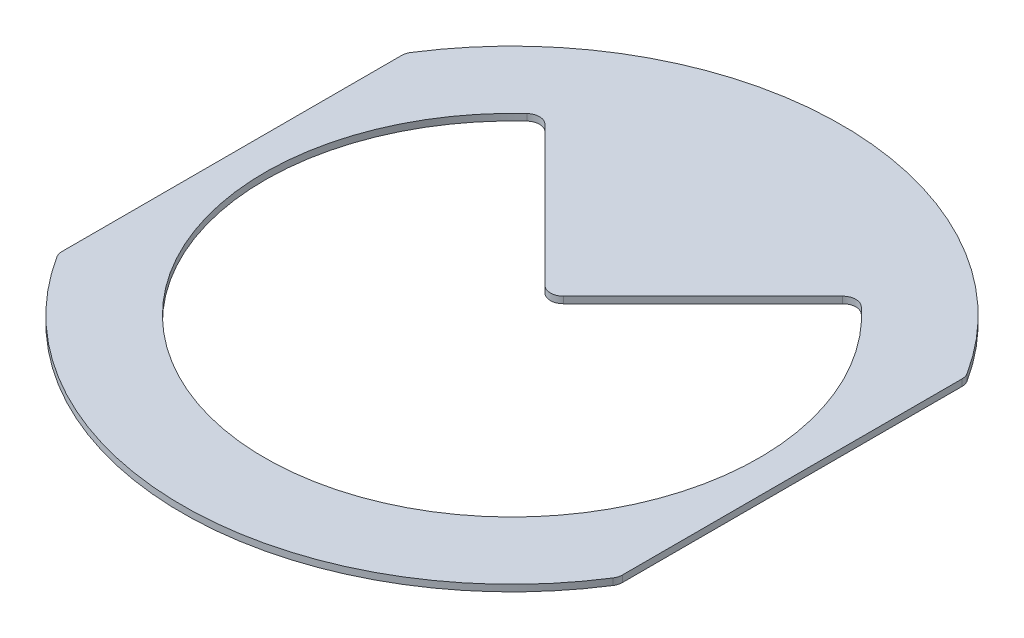
ISO-10303-21;
HEADER;
FILE_DESCRIPTION(('STEP AP214'),'2;1');
FILE_NAME('part.step','',(''),(''),'','','');
FILE_SCHEMA(('AUTOMOTIVE_DESIGN { 1 0 10303 214 1 1 1 1 }'));
ENDSEC;
DATA;
#1=APPLICATION_CONTEXT('core data for automotive mechanical design processes');
#2=APPLICATION_PROTOCOL_DEFINITION('international standard','automotive_design',2000,#1);
#3=PRODUCT_CONTEXT('',#1,'mechanical');
#4=PRODUCT('Part','Part','',(#3));
#5=PRODUCT_RELATED_PRODUCT_CATEGORY('part','',(#4));
#6=PRODUCT_DEFINITION_FORMATION('','',#4);
#7=PRODUCT_DEFINITION_CONTEXT('part definition',#1,'design');
#8=PRODUCT_DEFINITION('design','',#6,#7);
#9=PRODUCT_DEFINITION_SHAPE('','',#8);
#10=(LENGTH_UNIT() NAMED_UNIT(*) SI_UNIT(.MILLI.,.METRE.));
#11=(NAMED_UNIT(*) PLANE_ANGLE_UNIT() SI_UNIT($,.RADIAN.));
#12=(NAMED_UNIT(*) SI_UNIT($,.STERADIAN.) SOLID_ANGLE_UNIT());
#13=UNCERTAINTY_MEASURE_WITH_UNIT(LENGTH_MEASURE(1.E-05),#10,'distance_accuracy_value','');
#14=(GEOMETRIC_REPRESENTATION_CONTEXT(3) GLOBAL_UNCERTAINTY_ASSIGNED_CONTEXT((#13)) GLOBAL_UNIT_ASSIGNED_CONTEXT((#10,
#11,#12)) REPRESENTATION_CONTEXT('',''));
#15=CARTESIAN_POINT('',(0.,0.,0.));
#16=DIRECTION('',(0.,0.,1.));
#17=DIRECTION('',(1.,0.,0.));
#18=AXIS2_PLACEMENT_3D('',#15,#16,#17);
#19=CARTESIAN_POINT('',(0.,1.,0.));
#20=DIRECTION('',(0.,1.,0.));
#21=DIRECTION('',(0.,0.,1.));
#22=AXIS2_PLACEMENT_3D('',#19,#20,#21);
#23=PLANE('',#22);
#24=DIRECTION('',(0.,0.,-1.));
#25=VECTOR('',#24,1.);
#26=CARTESIAN_POINT('',(42.5,1.,-26.3391343821319));
#27=LINE('',#26,#25);
#28=CARTESIAN_POINT('',(42.5,1.,25.7633460559765));
#29=VERTEX_POINT('',#28);
#30=CARTESIAN_POINT('',(42.5,1.,-25.7633460559765));
#31=VERTEX_POINT('',#30);
#32=EDGE_CURVE('E162',#29,#31,#27,.T.);
#33=ORIENTED_EDGE('',*,*,#32,.T.);
#34=CARTESIAN_POINT('',(40.5,1.,-25.7633460559765));
#35=DIRECTION('',(0.,1.,0.));
#36=DIRECTION('',(0.,0.,1.));
#37=AXIS2_PLACEMENT_3D('',#34,#35,#36);
#38=CIRCLE('',#37,2.);
#39=CARTESIAN_POINT('',(42.1875,1.,-26.8368188083089));
#40=VERTEX_POINT('',#39);
#41=EDGE_CURVE('E203',#31,#40,#38,.T.);
#42=ORIENTED_EDGE('',*,*,#41,.T.);
#43=CARTESIAN_POINT('',(0.,1.,0.));
#44=DIRECTION('',(0.,1.,0.));
#45=DIRECTION('',(0.,0.,1.));
#46=AXIS2_PLACEMENT_3D('',#43,#44,#45);
#47=CIRCLE('',#46,50.);
#48=CARTESIAN_POINT('',(-42.1875,1.,-26.8368188083089));
#49=VERTEX_POINT('',#48);
#50=EDGE_CURVE('E245',#40,#49,#47,.T.);
#51=ORIENTED_EDGE('',*,*,#50,.T.);
#52=CARTESIAN_POINT('',(-40.5,1.,-25.7633460559765));
#53=DIRECTION('',(0.,1.,0.));
#54=DIRECTION('',(0.,0.,1.));
#55=AXIS2_PLACEMENT_3D('',#52,#53,#54);
#56=CIRCLE('',#55,2.);
#57=CARTESIAN_POINT('',(-42.5,1.,-25.7633460559765));
#58=VERTEX_POINT('',#57);
#59=EDGE_CURVE('E198',#49,#58,#56,.T.);
#60=ORIENTED_EDGE('',*,*,#59,.T.);
#61=DIRECTION('',(0.,0.,1.));
#62=VECTOR('',#61,1.);
#63=CARTESIAN_POINT('',(-42.5,1.,-26.3391343821319));
#64=LINE('',#63,#62);
#65=CARTESIAN_POINT('',(-42.5,1.,25.7633460559765));
#66=VERTEX_POINT('',#65);
#67=EDGE_CURVE('E248',#58,#66,#64,.T.);
#68=ORIENTED_EDGE('',*,*,#67,.T.);
#69=CARTESIAN_POINT('',(-40.5,1.,25.7633460559765));
#70=DIRECTION('',(0.,1.,0.));
#71=DIRECTION('',(0.,0.,1.));
#72=AXIS2_PLACEMENT_3D('',#69,#70,#71);
#73=CIRCLE('',#72,2.);
#74=CARTESIAN_POINT('',(-42.1875,1.,26.8368188083089));
#75=VERTEX_POINT('',#74);
#76=EDGE_CURVE('E57',#66,#75,#73,.T.);
#77=ORIENTED_EDGE('',*,*,#76,.T.);
#78=CARTESIAN_POINT('',(0.,1.,0.));
#79=DIRECTION('',(0.,1.,0.));
#80=DIRECTION('',(0.,0.,1.));
#81=AXIS2_PLACEMENT_3D('',#78,#79,#80);
#82=CIRCLE('',#81,50.);
#83=CARTESIAN_POINT('',(42.1875,1.,26.8368188083088));
#84=VERTEX_POINT('',#83);
#85=EDGE_CURVE('E167',#75,#84,#82,.T.);
#86=ORIENTED_EDGE('',*,*,#85,.T.);
#87=CARTESIAN_POINT('',(40.5,1.,25.7633460559765));
#88=DIRECTION('',(0.,1.,0.));
#89=DIRECTION('',(0.,0.,1.));
#90=AXIS2_PLACEMENT_3D('',#87,#88,#89);
#91=CIRCLE('',#90,2.);
#92=EDGE_CURVE('E201',#84,#29,#91,.T.);
#93=ORIENTED_EDGE('',*,*,#92,.T.);
#94=EDGE_LOOP('',(#33,#42,#51,#60,#68,#77,#86,#93));
#95=FACE_BOUND('',#94,.T.);
#96=DIRECTION('',(-0.707106781186547,0.,-0.707106781186549));
#97=VECTOR('',#96,1.);
#98=CARTESIAN_POINT('',(-23.8983901024285,1.,-28.8983901024286));
#99=LINE('',#98,#97);
#100=CARTESIAN_POINT('',(-1.41421356237309,1.,-6.4142135623731));
#101=VERTEX_POINT('',#100);
#102=CARTESIAN_POINT('',(-22.5787971763373,1.,-27.5787971763374));
#103=VERTEX_POINT('',#102);
#104=EDGE_CURVE('E239',#101,#103,#99,.T.);
#105=ORIENTED_EDGE('',*,*,#104,.F.);
#106=CARTESIAN_POINT('',(0.,1.,-7.8284271247462));
#107=DIRECTION('',(0.,1.,0.));
#108=DIRECTION('',(0.,0.,1.));
#109=AXIS2_PLACEMENT_3D('',#106,#107,#108);
#110=CIRCLE('',#109,2.);
#111=CARTESIAN_POINT('',(1.41421356237311,1.,-6.4142135623731));
#112=VERTEX_POINT('',#111);
#113=EDGE_CURVE('E161',#101,#112,#110,.T.);
#114=ORIENTED_EDGE('',*,*,#113,.T.);
#115=DIRECTION('',(-0.707106781186546,0.,0.707106781186549));
#116=VECTOR('',#115,1.);
#117=CARTESIAN_POINT('',(0.,1.,-5.));
#118=LINE('',#117,#116);
#119=CARTESIAN_POINT('',(22.5787971763373,1.,-27.5787971763374));
#120=VERTEX_POINT('',#119);
#121=EDGE_CURVE('E234',#120,#112,#118,.T.);
#122=ORIENTED_EDGE('',*,*,#121,.F.);
#123=CARTESIAN_POINT('',(23.9930107387104,1.,-26.1645836139643));
#124=DIRECTION('',(0.,1.,0.));
#125=DIRECTION('',(0.,0.,1.));
#126=AXIS2_PLACEMENT_3D('',#123,#124,#125);
#127=CIRCLE('',#126,2.);
#128=CARTESIAN_POINT('',(25.3447296535673,1.,-27.6386446626383));
#129=VERTEX_POINT('',#128);
#130=EDGE_CURVE('E11',#120,#129,#127,.F.);
#131=ORIENTED_EDGE('',*,*,#130,.T.);
#132=CARTESIAN_POINT('',(0.,1.,0.));
#133=DIRECTION('',(0.,1.,0.));
#134=DIRECTION('',(0.,0.,1.));
#135=AXIS2_PLACEMENT_3D('',#132,#133,#134);
#136=CIRCLE('',#135,37.5);
#137=CARTESIAN_POINT('',(-25.3447296535673,1.,-27.6386446626383));
#138=VERTEX_POINT('',#137);
#139=EDGE_CURVE('E158',#138,#129,#136,.T.);
#140=ORIENTED_EDGE('',*,*,#139,.F.);
#141=CARTESIAN_POINT('',(-23.9930107387104,1.,-26.1645836139643));
#142=DIRECTION('',(0.,1.,0.));
#143=DIRECTION('',(0.,0.,1.));
#144=AXIS2_PLACEMENT_3D('',#141,#142,#143);
#145=CIRCLE('',#144,2.);
#146=EDGE_CURVE('E216',#138,#103,#145,.F.);
#147=ORIENTED_EDGE('',*,*,#146,.T.);
#148=EDGE_LOOP('',(#105,#114,#122,#131,#140,#147));
#149=FACE_BOUND('',#148,.T.);
#150=ADVANCED_FACE('F35',(#95,#149),#23,.T.);
#151=CARTESIAN_POINT('',(0.,0.,0.));
#152=DIRECTION('',(0.,1.,0.));
#153=DIRECTION('',(0.,0.,1.));
#154=AXIS2_PLACEMENT_3D('',#151,#152,#153);
#155=PLANE('',#154);
#156=CARTESIAN_POINT('',(0.,0.,0.));
#157=DIRECTION('',(0.,1.,0.));
#158=DIRECTION('',(0.,0.,1.));
#159=AXIS2_PLACEMENT_3D('',#156,#157,#158);
#160=CIRCLE('',#159,50.);
#161=CARTESIAN_POINT('',(42.1875,0.,-26.8368188083089));
#162=VERTEX_POINT('',#161);
#163=CARTESIAN_POINT('',(-42.1875,0.,-26.8368188083089));
#164=VERTEX_POINT('',#163);
#165=EDGE_CURVE('E243',#162,#164,#160,.T.);
#166=ORIENTED_EDGE('',*,*,#165,.F.);
#167=CARTESIAN_POINT('',(40.5,0.,-25.7633460559765));
#168=DIRECTION('',(0.,1.,0.));
#169=DIRECTION('',(0.,0.,1.));
#170=AXIS2_PLACEMENT_3D('',#167,#168,#169);
#171=CIRCLE('',#170,2.);
#172=CARTESIAN_POINT('',(42.5,0.,-25.7633460559765));
#173=VERTEX_POINT('',#172);
#174=EDGE_CURVE('E190',#162,#173,#171,.F.);
#175=ORIENTED_EDGE('',*,*,#174,.T.);
#176=DIRECTION('',(0.,0.,-1.));
#177=VECTOR('',#176,1.);
#178=CARTESIAN_POINT('',(42.5,0.,-26.3391343821319));
#179=LINE('',#178,#177);
#180=CARTESIAN_POINT('',(42.5,0.,25.7633460559765));
#181=VERTEX_POINT('',#180);
#182=EDGE_CURVE('E170',#181,#173,#179,.T.);
#183=ORIENTED_EDGE('',*,*,#182,.F.);
#184=CARTESIAN_POINT('',(40.5,0.,25.7633460559765));
#185=DIRECTION('',(0.,1.,0.));
#186=DIRECTION('',(0.,0.,1.));
#187=AXIS2_PLACEMENT_3D('',#184,#185,#186);
#188=CIRCLE('',#187,2.);
#189=CARTESIAN_POINT('',(42.1875,0.,26.8368188083088));
#190=VERTEX_POINT('',#189);
#191=EDGE_CURVE('E188',#181,#190,#188,.F.);
#192=ORIENTED_EDGE('',*,*,#191,.T.);
#193=CARTESIAN_POINT('',(0.,0.,0.));
#194=DIRECTION('',(0.,1.,0.));
#195=DIRECTION('',(0.,0.,1.));
#196=AXIS2_PLACEMENT_3D('',#193,#194,#195);
#197=CIRCLE('',#196,50.);
#198=CARTESIAN_POINT('',(-42.1875,0.,26.8368188083089));
#199=VERTEX_POINT('',#198);
#200=EDGE_CURVE('E255',#199,#190,#197,.T.);
#201=ORIENTED_EDGE('',*,*,#200,.F.);
#202=CARTESIAN_POINT('',(-40.5,0.,25.7633460559765));
#203=DIRECTION('',(0.,1.,0.));
#204=DIRECTION('',(0.,0.,1.));
#205=AXIS2_PLACEMENT_3D('',#202,#203,#204);
#206=CIRCLE('',#205,2.);
#207=CARTESIAN_POINT('',(-42.5,0.,25.7633460559765));
#208=VERTEX_POINT('',#207);
#209=EDGE_CURVE('E186',#199,#208,#206,.F.);
#210=ORIENTED_EDGE('',*,*,#209,.T.);
#211=DIRECTION('',(0.,0.,1.));
#212=VECTOR('',#211,1.);
#213=CARTESIAN_POINT('',(-42.5,0.,-26.3391343821319));
#214=LINE('',#213,#212);
#215=CARTESIAN_POINT('',(-42.5,0.,-25.7633460559765));
#216=VERTEX_POINT('',#215);
#217=EDGE_CURVE('E253',#216,#208,#214,.T.);
#218=ORIENTED_EDGE('',*,*,#217,.F.);
#219=CARTESIAN_POINT('',(-40.5,0.,-25.7633460559765));
#220=DIRECTION('',(0.,1.,0.));
#221=DIRECTION('',(0.,0.,1.));
#222=AXIS2_PLACEMENT_3D('',#219,#220,#221);
#223=CIRCLE('',#222,2.);
#224=EDGE_CURVE('E147',#216,#164,#223,.F.);
#225=ORIENTED_EDGE('',*,*,#224,.T.);
#226=EDGE_LOOP('',(#166,#175,#183,#192,#201,#210,#218,#225));
#227=FACE_BOUND('',#226,.T.);
#228=DIRECTION('',(-0.707106781186546,0.,0.707106781186549));
#229=VECTOR('',#228,1.);
#230=CARTESIAN_POINT('',(0.,0.,-5.));
#231=LINE('',#230,#229);
#232=CARTESIAN_POINT('',(22.5787971763373,0.,-27.5787971763374));
#233=VERTEX_POINT('',#232);
#234=CARTESIAN_POINT('',(1.41421356237311,0.,-6.4142135623731));
#235=VERTEX_POINT('',#234);
#236=EDGE_CURVE('E142',#233,#235,#231,.T.);
#237=ORIENTED_EDGE('',*,*,#236,.T.);
#238=CARTESIAN_POINT('',(0.,0.,-7.8284271247462));
#239=DIRECTION('',(0.,1.,0.));
#240=DIRECTION('',(0.,0.,1.));
#241=AXIS2_PLACEMENT_3D('',#238,#239,#240);
#242=CIRCLE('',#241,2.);
#243=CARTESIAN_POINT('',(-1.41421356237309,0.,-6.4142135623731));
#244=VERTEX_POINT('',#243);
#245=EDGE_CURVE('E137',#235,#244,#242,.F.);
#246=ORIENTED_EDGE('',*,*,#245,.T.);
#247=DIRECTION('',(-0.707106781186547,0.,-0.707106781186549));
#248=VECTOR('',#247,1.);
#249=CARTESIAN_POINT('',(-23.8983901024285,0.,-28.8983901024286));
#250=LINE('',#249,#248);
#251=CARTESIAN_POINT('',(-22.5787971763373,0.,-27.5787971763374));
#252=VERTEX_POINT('',#251);
#253=EDGE_CURVE('E140',#244,#252,#250,.T.);
#254=ORIENTED_EDGE('',*,*,#253,.T.);
#255=CARTESIAN_POINT('',(-23.9930107387104,0.,-26.1645836139643));
#256=DIRECTION('',(0.,1.,0.));
#257=DIRECTION('',(0.,0.,1.));
#258=AXIS2_PLACEMENT_3D('',#255,#256,#257);
#259=CIRCLE('',#258,2.);
#260=CARTESIAN_POINT('',(-25.3447296535673,0.,-27.6386446626383));
#261=VERTEX_POINT('',#260);
#262=EDGE_CURVE('E214',#252,#261,#259,.T.);
#263=ORIENTED_EDGE('',*,*,#262,.T.);
#264=CARTESIAN_POINT('',(0.,0.,0.));
#265=DIRECTION('',(0.,1.,0.));
#266=DIRECTION('',(0.,0.,1.));
#267=AXIS2_PLACEMENT_3D('',#264,#265,#266);
#268=CIRCLE('',#267,37.5);
#269=CARTESIAN_POINT('',(25.3447296535673,0.,-27.6386446626383));
#270=VERTEX_POINT('',#269);
#271=EDGE_CURVE('E219',#261,#270,#268,.T.);
#272=ORIENTED_EDGE('',*,*,#271,.T.);
#273=CARTESIAN_POINT('',(23.9930107387104,0.,-26.1645836139643));
#274=DIRECTION('',(0.,1.,0.));
#275=DIRECTION('',(0.,0.,1.));
#276=AXIS2_PLACEMENT_3D('',#273,#274,#275);
#277=CIRCLE('',#276,2.);
#278=EDGE_CURVE('E43',#270,#233,#277,.T.);
#279=ORIENTED_EDGE('',*,*,#278,.T.);
#280=EDGE_LOOP('',(#237,#246,#254,#263,#272,#279));
#281=FACE_BOUND('',#280,.T.);
#282=ADVANCED_FACE('F139',(#227,#281),#155,.F.);
#283=CARTESIAN_POINT('',(0.,1.,0.));
#284=DIRECTION('',(0.,-1.,0.));
#285=DIRECTION('',(0.,0.,-1.));
#286=AXIS2_PLACEMENT_3D('',#283,#284,#285);
#287=CYLINDRICAL_SURFACE('',#286,50.);
#288=ORIENTED_EDGE('',*,*,#50,.F.);
#289=DIRECTION('',(0.,-1.,0.));
#290=VECTOR('',#289,1.);
#291=CARTESIAN_POINT('',(42.1875,1.,-26.8368188083089));
#292=LINE('',#291,#290);
#293=EDGE_CURVE('E148',#40,#162,#292,.T.);
#294=ORIENTED_EDGE('',*,*,#293,.T.);
#295=ORIENTED_EDGE('',*,*,#165,.T.);
#296=DIRECTION('',(0.,-1.,0.));
#297=VECTOR('',#296,1.);
#298=CARTESIAN_POINT('',(-42.1875,1.,-26.8368188083089));
#299=LINE('',#298,#297);
#300=EDGE_CURVE('E181',#164,#49,#299,.F.);
#301=ORIENTED_EDGE('',*,*,#300,.T.);
#302=EDGE_LOOP('',(#288,#294,#295,#301));
#303=FACE_BOUND('',#302,.T.);
#304=ADVANCED_FACE('F272',(#303),#287,.T.);
#305=CARTESIAN_POINT('',(-42.5,1.,-26.3391343821319));
#306=DIRECTION('',(1.,0.,0.));
#307=DIRECTION('',(0.,0.,-1.));
#308=AXIS2_PLACEMENT_3D('',#305,#306,#307);
#309=PLANE('',#308);
#310=ORIENTED_EDGE('',*,*,#217,.T.);
#311=DIRECTION('',(0.,-1.,0.));
#312=VECTOR('',#311,1.);
#313=CARTESIAN_POINT('',(-42.5,1.,25.7633460559765));
#314=LINE('',#313,#312);
#315=EDGE_CURVE('E212',#208,#66,#314,.F.);
#316=ORIENTED_EDGE('',*,*,#315,.T.);
#317=ORIENTED_EDGE('',*,*,#67,.F.);
#318=DIRECTION('',(0.,-1.,0.));
#319=VECTOR('',#318,1.);
#320=CARTESIAN_POINT('',(-42.5,1.,-25.7633460559765));
#321=LINE('',#320,#319);
#322=EDGE_CURVE('E209',#58,#216,#321,.T.);
#323=ORIENTED_EDGE('',*,*,#322,.T.);
#324=EDGE_LOOP('',(#310,#316,#317,#323));
#325=FACE_BOUND('',#324,.T.);
#326=ADVANCED_FACE('F280',(#325),#309,.F.);
#327=CARTESIAN_POINT('',(0.,1.,0.));
#328=DIRECTION('',(0.,-1.,0.));
#329=DIRECTION('',(0.,0.,-1.));
#330=AXIS2_PLACEMENT_3D('',#327,#328,#329);
#331=CYLINDRICAL_SURFACE('',#330,50.);
#332=ORIENTED_EDGE('',*,*,#200,.T.);
#333=DIRECTION('',(0.,-1.,0.));
#334=VECTOR('',#333,1.);
#335=CARTESIAN_POINT('',(42.1875,1.,26.8368188083088));
#336=LINE('',#335,#334);
#337=EDGE_CURVE('E50',#190,#84,#336,.F.);
#338=ORIENTED_EDGE('',*,*,#337,.T.);
#339=ORIENTED_EDGE('',*,*,#85,.F.);
#340=DIRECTION('',(0.,-1.,0.));
#341=VECTOR('',#340,1.);
#342=CARTESIAN_POINT('',(-42.1875,1.,26.8368188083089));
#343=LINE('',#342,#341);
#344=EDGE_CURVE('E205',#75,#199,#343,.T.);
#345=ORIENTED_EDGE('',*,*,#344,.T.);
#346=EDGE_LOOP('',(#332,#338,#339,#345));
#347=FACE_BOUND('',#346,.T.);
#348=ADVANCED_FACE('F286',(#347),#331,.T.);
#349=CARTESIAN_POINT('',(42.5,1.,-26.3391343821319));
#350=DIRECTION('',(-1.,0.,0.));
#351=DIRECTION('',(0.,0.,1.));
#352=AXIS2_PLACEMENT_3D('',#349,#350,#351);
#353=PLANE('',#352);
#354=ORIENTED_EDGE('',*,*,#182,.T.);
#355=DIRECTION('',(0.,-1.,0.));
#356=VECTOR('',#355,1.);
#357=CARTESIAN_POINT('',(42.5,1.,-25.7633460559765));
#358=LINE('',#357,#356);
#359=EDGE_CURVE('E195',#173,#31,#358,.F.);
#360=ORIENTED_EDGE('',*,*,#359,.T.);
#361=ORIENTED_EDGE('',*,*,#32,.F.);
#362=DIRECTION('',(0.,-1.,0.));
#363=VECTOR('',#362,1.);
#364=CARTESIAN_POINT('',(42.5,1.,25.7633460559765));
#365=LINE('',#364,#363);
#366=EDGE_CURVE('E192',#29,#181,#365,.T.);
#367=ORIENTED_EDGE('',*,*,#366,.T.);
#368=EDGE_LOOP('',(#354,#360,#361,#367));
#369=FACE_BOUND('',#368,.T.);
#370=ADVANCED_FACE('F261',(#369),#353,.F.);
#371=CARTESIAN_POINT('',(0.,1.,0.));
#372=DIRECTION('',(0.,-1.,0.));
#373=DIRECTION('',(0.,0.,-1.));
#374=AXIS2_PLACEMENT_3D('',#371,#372,#373);
#375=CYLINDRICAL_SURFACE('',#374,37.5);
#376=ORIENTED_EDGE('',*,*,#271,.F.);
#377=DIRECTION('',(0.,-1.,0.));
#378=VECTOR('',#377,1.);
#379=CARTESIAN_POINT('',(-25.3447296535673,1.,-27.6386446626383));
#380=LINE('',#379,#378);
#381=EDGE_CURVE('E175',#261,#138,#380,.F.);
#382=ORIENTED_EDGE('',*,*,#381,.T.);
#383=ORIENTED_EDGE('',*,*,#139,.T.);
#384=DIRECTION('',(0.,-1.,0.));
#385=VECTOR('',#384,1.);
#386=CARTESIAN_POINT('',(25.3447296535673,1.,-27.6386446626383));
#387=LINE('',#386,#385);
#388=EDGE_CURVE('E164',#129,#270,#387,.T.);
#389=ORIENTED_EDGE('',*,*,#388,.T.);
#390=EDGE_LOOP('',(#376,#382,#383,#389));
#391=FACE_BOUND('',#390,.T.);
#392=ADVANCED_FACE('F236',(#391),#375,.F.);
#393=CARTESIAN_POINT('',(0.,1.,-5.));
#394=DIRECTION('',(0.707106781186549,0.,0.707106781186546));
#395=DIRECTION('',(0.707106781186546,0.,-0.707106781186549));
#396=AXIS2_PLACEMENT_3D('',#393,#394,#395);
#397=PLANE('',#396);
#398=ORIENTED_EDGE('',*,*,#236,.F.);
#399=DIRECTION('',(0.,1.,0.));
#400=VECTOR('',#399,1.);
#401=CARTESIAN_POINT('',(22.5787971763373,1.,-27.5787971763374));
#402=LINE('',#401,#400);
#403=EDGE_CURVE('E179',#233,#120,#402,.T.);
#404=ORIENTED_EDGE('',*,*,#403,.T.);
#405=ORIENTED_EDGE('',*,*,#121,.T.);
#406=DIRECTION('',(0.,-1.,0.));
#407=VECTOR('',#406,1.);
#408=CARTESIAN_POINT('',(1.41421356237311,1.,-6.41421356237311));
#409=LINE('',#408,#407);
#410=EDGE_CURVE('E177',#112,#235,#409,.T.);
#411=ORIENTED_EDGE('',*,*,#410,.T.);
#412=EDGE_LOOP('',(#398,#404,#405,#411));
#413=FACE_BOUND('',#412,.T.);
#414=ADVANCED_FACE('F224',(#413),#397,.T.);
#415=CARTESIAN_POINT('',(-23.8983901024285,1.,-28.8983901024286));
#416=DIRECTION('',(-0.707106781186549,0.,0.707106781186547));
#417=DIRECTION('',(0.707106781186547,0.,0.707106781186549));
#418=AXIS2_PLACEMENT_3D('',#415,#416,#417);
#419=PLANE('',#418);
#420=ORIENTED_EDGE('',*,*,#104,.T.);
#421=DIRECTION('',(0.,1.,0.));
#422=VECTOR('',#421,1.);
#423=CARTESIAN_POINT('',(-22.5787971763373,0.,-27.5787971763374));
#424=LINE('',#423,#422);
#425=EDGE_CURVE('E157',#103,#252,#424,.F.);
#426=ORIENTED_EDGE('',*,*,#425,.T.);
#427=ORIENTED_EDGE('',*,*,#253,.F.);
#428=DIRECTION('',(0.,-1.,0.));
#429=VECTOR('',#428,1.);
#430=CARTESIAN_POINT('',(-1.41421356237309,1.,-6.4142135623731));
#431=LINE('',#430,#429);
#432=EDGE_CURVE('E154',#244,#101,#431,.F.);
#433=ORIENTED_EDGE('',*,*,#432,.T.);
#434=EDGE_LOOP('',(#420,#426,#427,#433));
#435=FACE_BOUND('',#434,.T.);
#436=ADVANCED_FACE('F153',(#435),#419,.T.);
#437=CARTESIAN_POINT('',(-23.9930107387104,1.,-26.1645836139643));
#438=DIRECTION('',(0.,-1.,0.));
#439=DIRECTION('',(0.,0.,-1.));
#440=AXIS2_PLACEMENT_3D('',#437,#438,#439);
#441=CYLINDRICAL_SURFACE('',#440,2.);
#442=ORIENTED_EDGE('',*,*,#146,.F.);
#443=ORIENTED_EDGE('',*,*,#381,.F.);
#444=ORIENTED_EDGE('',*,*,#262,.F.);
#445=ORIENTED_EDGE('',*,*,#425,.F.);
#446=EDGE_LOOP('',(#442,#443,#444,#445));
#447=FACE_BOUND('',#446,.T.);
#448=ADVANCED_FACE('F315',(#447),#441,.F.);
#449=CARTESIAN_POINT('',(23.9930107387104,1.,-26.1645836139643));
#450=DIRECTION('',(0.,-1.,0.));
#451=DIRECTION('',(0.,0.,-1.));
#452=AXIS2_PLACEMENT_3D('',#449,#450,#451);
#453=CYLINDRICAL_SURFACE('',#452,2.);
#454=ORIENTED_EDGE('',*,*,#130,.F.);
#455=ORIENTED_EDGE('',*,*,#403,.F.);
#456=ORIENTED_EDGE('',*,*,#278,.F.);
#457=ORIENTED_EDGE('',*,*,#388,.F.);
#458=EDGE_LOOP('',(#454,#455,#456,#457));
#459=FACE_BOUND('',#458,.T.);
#460=ADVANCED_FACE('F229',(#459),#453,.F.);
#461=CARTESIAN_POINT('',(40.5,1.,-25.7633460559765));
#462=DIRECTION('',(0.,-1.,0.));
#463=DIRECTION('',(0.,0.,-1.));
#464=AXIS2_PLACEMENT_3D('',#461,#462,#463);
#465=CYLINDRICAL_SURFACE('',#464,2.);
#466=ORIENTED_EDGE('',*,*,#41,.F.);
#467=ORIENTED_EDGE('',*,*,#359,.F.);
#468=ORIENTED_EDGE('',*,*,#174,.F.);
#469=ORIENTED_EDGE('',*,*,#293,.F.);
#470=EDGE_LOOP('',(#466,#467,#468,#469));
#471=FACE_BOUND('',#470,.T.);
#472=ADVANCED_FACE('F267',(#471),#465,.T.);
#473=CARTESIAN_POINT('',(40.5,1.,25.7633460559765));
#474=DIRECTION('',(0.,-1.,0.));
#475=DIRECTION('',(0.,0.,-1.));
#476=AXIS2_PLACEMENT_3D('',#473,#474,#475);
#477=CYLINDRICAL_SURFACE('',#476,2.);
#478=ORIENTED_EDGE('',*,*,#92,.F.);
#479=ORIENTED_EDGE('',*,*,#337,.F.);
#480=ORIENTED_EDGE('',*,*,#191,.F.);
#481=ORIENTED_EDGE('',*,*,#366,.F.);
#482=EDGE_LOOP('',(#478,#479,#480,#481));
#483=FACE_BOUND('',#482,.T.);
#484=ADVANCED_FACE('F289',(#483),#477,.T.);
#485=CARTESIAN_POINT('',(-40.5,1.,25.7633460559765));
#486=DIRECTION('',(0.,-1.,0.));
#487=DIRECTION('',(0.,0.,-1.));
#488=AXIS2_PLACEMENT_3D('',#485,#486,#487);
#489=CYLINDRICAL_SURFACE('',#488,2.);
#490=ORIENTED_EDGE('',*,*,#76,.F.);
#491=ORIENTED_EDGE('',*,*,#315,.F.);
#492=ORIENTED_EDGE('',*,*,#209,.F.);
#493=ORIENTED_EDGE('',*,*,#344,.F.);
#494=EDGE_LOOP('',(#490,#491,#492,#493));
#495=FACE_BOUND('',#494,.T.);
#496=ADVANCED_FACE('F284',(#495),#489,.T.);
#497=CARTESIAN_POINT('',(-40.5,1.,-25.7633460559765));
#498=DIRECTION('',(0.,-1.,0.));
#499=DIRECTION('',(0.,0.,-1.));
#500=AXIS2_PLACEMENT_3D('',#497,#498,#499);
#501=CYLINDRICAL_SURFACE('',#500,2.);
#502=ORIENTED_EDGE('',*,*,#59,.F.);
#503=ORIENTED_EDGE('',*,*,#300,.F.);
#504=ORIENTED_EDGE('',*,*,#224,.F.);
#505=ORIENTED_EDGE('',*,*,#322,.F.);
#506=EDGE_LOOP('',(#502,#503,#504,#505));
#507=FACE_BOUND('',#506,.T.);
#508=ADVANCED_FACE('F276',(#507),#501,.T.);
#509=CARTESIAN_POINT('',(0.,1.,-7.8284271247462));
#510=DIRECTION('',(0.,-1.,0.));
#511=DIRECTION('',(0.,0.,-1.));
#512=AXIS2_PLACEMENT_3D('',#509,#510,#511);
#513=CYLINDRICAL_SURFACE('',#512,2.);
#514=ORIENTED_EDGE('',*,*,#113,.F.);
#515=ORIENTED_EDGE('',*,*,#432,.F.);
#516=ORIENTED_EDGE('',*,*,#245,.F.);
#517=ORIENTED_EDGE('',*,*,#410,.F.);
#518=EDGE_LOOP('',(#514,#515,#516,#517));
#519=FACE_BOUND('',#518,.T.);
#520=ADVANCED_FACE('F37',(#519),#513,.T.);
#521=CLOSED_SHELL('',(#150,#282,#304,#326,#348,#370,#392,#414,#436,#448,#460,#472,#484,#496,
#508,#520));
#522=MANIFOLD_SOLID_BREP('B2',#521);
#523=ADVANCED_BREP_SHAPE_REPRESENTATION('',(#18,#522),#14);
#524=SHAPE_DEFINITION_REPRESENTATION(#9,#523);
ENDSEC;
END-ISO-10303-21;
